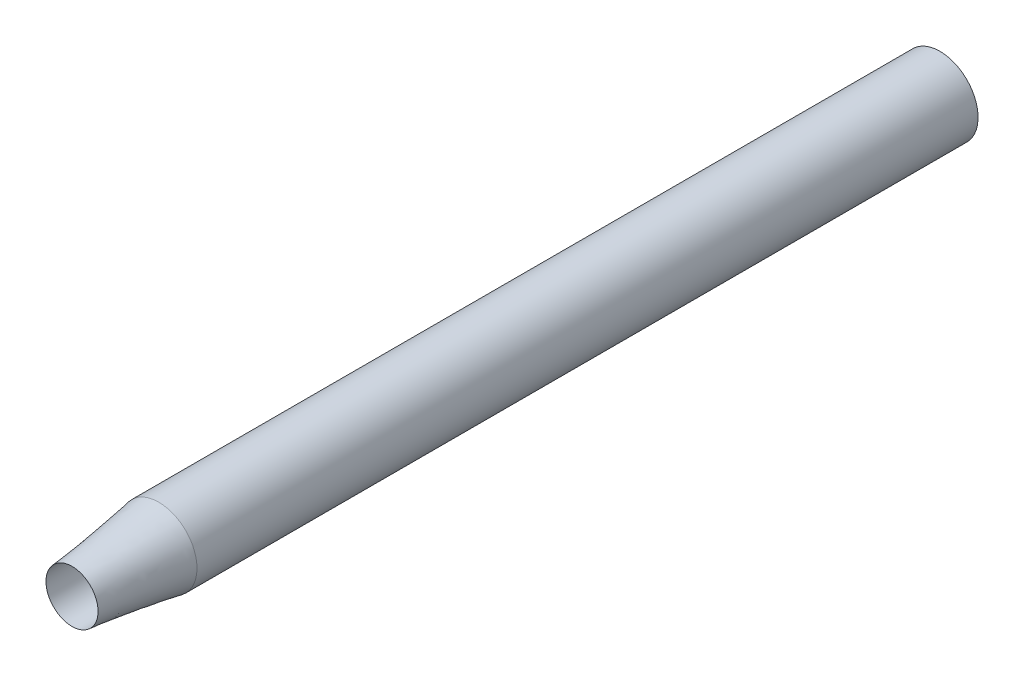
ISO-10303-21;
HEADER;
FILE_DESCRIPTION(('STEP AP214'),'2;1');
FILE_NAME('part.step','',(''),(''),'','','');
FILE_SCHEMA(('AUTOMOTIVE_DESIGN { 1 0 10303 214 1 1 1 1 }'));
ENDSEC;
DATA;
#1=APPLICATION_CONTEXT('core data for automotive mechanical design processes');
#2=APPLICATION_PROTOCOL_DEFINITION('international standard','automotive_design',2000,#1);
#3=PRODUCT_CONTEXT('',#1,'mechanical');
#4=PRODUCT('Part','Part','',(#3));
#5=PRODUCT_RELATED_PRODUCT_CATEGORY('part','',(#4));
#6=PRODUCT_DEFINITION_FORMATION('','',#4);
#7=PRODUCT_DEFINITION_CONTEXT('part definition',#1,'design');
#8=PRODUCT_DEFINITION('design','',#6,#7);
#9=PRODUCT_DEFINITION_SHAPE('','',#8);
#10=(LENGTH_UNIT() NAMED_UNIT(*) SI_UNIT(.MILLI.,.METRE.));
#11=(NAMED_UNIT(*) PLANE_ANGLE_UNIT() SI_UNIT($,.RADIAN.));
#12=(NAMED_UNIT(*) SI_UNIT($,.STERADIAN.) SOLID_ANGLE_UNIT());
#13=UNCERTAINTY_MEASURE_WITH_UNIT(LENGTH_MEASURE(1.E-05),#10,'distance_accuracy_value','');
#14=(GEOMETRIC_REPRESENTATION_CONTEXT(3) GLOBAL_UNCERTAINTY_ASSIGNED_CONTEXT((#13)) GLOBAL_UNIT_ASSIGNED_CONTEXT((#10,
#11,#12)) REPRESENTATION_CONTEXT('',''));
#15=CARTESIAN_POINT('',(0.,0.,0.));
#16=DIRECTION('',(0.,0.,1.));
#17=DIRECTION('',(1.,0.,0.));
#18=AXIS2_PLACEMENT_3D('',#15,#16,#17);
#19=CARTESIAN_POINT('',(0.,0.,45.));
#20=DIRECTION('',(0.,0.,-1.));
#21=DIRECTION('',(-1.,0.,0.));
#22=AXIS2_PLACEMENT_3D('',#19,#20,#21);
#23=CYLINDRICAL_SURFACE('',#22,2.2);
#24=CARTESIAN_POINT('',(0.,0.,45.));
#25=DIRECTION('',(0.,0.,-1.));
#26=DIRECTION('',(-1.,0.,0.));
#27=AXIS2_PLACEMENT_3D('',#24,#25,#26);
#28=CIRCLE('',#27,2.2);
#29=CARTESIAN_POINT('',(-2.2,0.,45.));
#30=VERTEX_POINT('',#29);
#31=EDGE_CURVE('E11',#30,#30,#28,.F.);
#32=CARTESIAN_POINT('',(0.,0.,0.));
#33=DIRECTION('',(0.,0.,1.));
#34=DIRECTION('',(1.,0.,0.));
#35=AXIS2_PLACEMENT_3D('',#32,#33,#34);
#36=CIRCLE('',#35,2.2);
#37=CARTESIAN_POINT('',(-2.2,0.,0.));
#38=VERTEX_POINT('',#37);
#39=EDGE_CURVE('E60',#38,#38,#36,.T.);
#40=CARTESIAN_POINT('',(-2.2,0.,45.));
#41=CARTESIAN_POINT('',(-2.2,0.,44.53125));
#42=CARTESIAN_POINT('',(-2.2,0.,44.0625));
#43=CARTESIAN_POINT('',(-2.2,0.,43.125));
#44=CARTESIAN_POINT('',(-2.2,0.,42.65625));
#45=CARTESIAN_POINT('',(-2.2,0.,41.71875));
#46=CARTESIAN_POINT('',(-2.2,0.,41.25));
#47=CARTESIAN_POINT('',(-2.2,0.,40.3125));
#48=CARTESIAN_POINT('',(-2.2,0.,39.84375));
#49=CARTESIAN_POINT('',(-2.2,0.,38.90625));
#50=CARTESIAN_POINT('',(-2.2,0.,38.4375));
#51=CARTESIAN_POINT('',(-2.2,0.,37.5));
#52=CARTESIAN_POINT('',(-2.2,0.,37.03125));
#53=CARTESIAN_POINT('',(-2.2,0.,36.09375));
#54=CARTESIAN_POINT('',(-2.2,0.,35.625));
#55=CARTESIAN_POINT('',(-2.2,0.,34.6875));
#56=CARTESIAN_POINT('',(-2.2,0.,34.21875));
#57=CARTESIAN_POINT('',(-2.2,0.,33.28125));
#58=CARTESIAN_POINT('',(-2.2,0.,32.8125));
#59=CARTESIAN_POINT('',(-2.2,0.,31.875));
#60=CARTESIAN_POINT('',(-2.2,0.,31.40625));
#61=CARTESIAN_POINT('',(-2.2,0.,30.46875));
#62=CARTESIAN_POINT('',(-2.2,0.,30.));
#63=CARTESIAN_POINT('',(-2.2,0.,29.0625));
#64=CARTESIAN_POINT('',(-2.2,0.,28.59375));
#65=CARTESIAN_POINT('',(-2.2,0.,27.65625));
#66=CARTESIAN_POINT('',(-2.2,0.,27.1875));
#67=CARTESIAN_POINT('',(-2.2,0.,26.25));
#68=CARTESIAN_POINT('',(-2.2,0.,25.78125));
#69=CARTESIAN_POINT('',(-2.2,0.,24.84375));
#70=CARTESIAN_POINT('',(-2.2,0.,24.375));
#71=CARTESIAN_POINT('',(-2.2,0.,23.4375));
#72=CARTESIAN_POINT('',(-2.2,0.,22.96875));
#73=CARTESIAN_POINT('',(-2.2,0.,22.03125));
#74=CARTESIAN_POINT('',(-2.2,0.,21.5625));
#75=CARTESIAN_POINT('',(-2.2,0.,20.625));
#76=CARTESIAN_POINT('',(-2.2,0.,20.15625));
#77=CARTESIAN_POINT('',(-2.2,0.,19.21875));
#78=CARTESIAN_POINT('',(-2.2,0.,18.75));
#79=CARTESIAN_POINT('',(-2.2,0.,17.8125));
#80=CARTESIAN_POINT('',(-2.2,0.,17.34375));
#81=CARTESIAN_POINT('',(-2.2,0.,16.40625));
#82=CARTESIAN_POINT('',(-2.2,0.,15.9375));
#83=CARTESIAN_POINT('',(-2.2,0.,15.));
#84=CARTESIAN_POINT('',(-2.2,0.,14.53125));
#85=CARTESIAN_POINT('',(-2.2,0.,13.59375));
#86=CARTESIAN_POINT('',(-2.2,0.,13.125));
#87=CARTESIAN_POINT('',(-2.2,0.,12.1875));
#88=CARTESIAN_POINT('',(-2.2,0.,11.71875));
#89=CARTESIAN_POINT('',(-2.2,0.,10.78125));
#90=CARTESIAN_POINT('',(-2.2,0.,10.3125));
#91=CARTESIAN_POINT('',(-2.2,0.,9.375));
#92=CARTESIAN_POINT('',(-2.2,0.,8.90625));
#93=CARTESIAN_POINT('',(-2.2,0.,7.96874999999999));
#94=CARTESIAN_POINT('',(-2.2,0.,7.5));
#95=CARTESIAN_POINT('',(-2.2,0.,6.5625));
#96=CARTESIAN_POINT('',(-2.2,0.,6.09375));
#97=CARTESIAN_POINT('',(-2.2,0.,5.15625));
#98=CARTESIAN_POINT('',(-2.2,0.,4.68749999999999));
#99=CARTESIAN_POINT('',(-2.2,0.,3.74999999999999));
#100=CARTESIAN_POINT('',(-2.2,0.,3.28124999999999));
#101=CARTESIAN_POINT('',(-2.2,0.,2.34374999999999));
#102=CARTESIAN_POINT('',(-2.2,0.,1.87499999999999));
#103=CARTESIAN_POINT('',(-2.2,0.,0.937499999999992));
#104=CARTESIAN_POINT('',(-2.2,0.,0.468749999999993));
#105=CARTESIAN_POINT('',(-2.2,0.,0.));
#106=B_SPLINE_CURVE_WITH_KNOTS('',3,(#40,#41,#42,#43,#44,#45,#46,#47,#48,#49,#50,#51,#52,#53,
#54,#55,#56,#57,#58,#59,#60,#61,#62,#63,#64,#65,#66,#67,#68,#69,#70,#71,#72,#73,#74,#75,#76,#77,
#78,#79,#80,#81,#82,#83,#84,#85,#86,#87,#88,#89,#90,#91,#92,#93,#94,#95,#96,#97,#98,#99,#100,
#101,#102,#103,#104,#105),.UNSPECIFIED.,.F.,.F.,(4,2,2,2,2,2,2,2,2,2,2,2,2,2,2,2,2,2,2,2,2,2,2,
2,2,2,2,2,2,2,2,2,4),(0.,1.40625,2.8125,4.21874999999999,5.625,7.03125,8.4375,9.84375,11.25,
12.65625,14.0625,15.46875,16.875,18.28125,19.6875,21.09375,22.5,23.90625,25.3125,26.71875,
28.125,29.53125,30.9375,32.34375,33.75,35.15625,36.5625,37.96875,39.375,40.78125,42.1875,
43.59375,45.),.UNSPECIFIED.);
#107=EDGE_CURVE('BSEAM50',#30,#38,#106,.T.);
#108=ORIENTED_EDGE('',*,*,#31,.F.);
#109=ORIENTED_EDGE('',*,*,#39,.T.);
#110=ORIENTED_EDGE('',*,*,#107,.T.);
#111=ORIENTED_EDGE('',*,*,#107,.F.);
#112=EDGE_LOOP('',(#108,#110,#109,#111));
#113=FACE_BOUND('',#112,.T.);
#114=ADVANCED_FACE('F50',(#113),#23,.T.);
#115=CARTESIAN_POINT('',(0.,0.,0.));
#116=DIRECTION('',(0.,0.,1.));
#117=DIRECTION('',(1.,0.,0.));
#118=AXIS2_PLACEMENT_3D('',#115,#116,#117);
#119=PLANE('',#118);
#120=CARTESIAN_POINT('',(0.,0.,0.));
#121=DIRECTION('',(0.,0.,1.));
#122=DIRECTION('',(1.,0.,0.));
#123=AXIS2_PLACEMENT_3D('',#120,#121,#122);
#124=CIRCLE('',#123,1.5);
#125=CARTESIAN_POINT('',(1.5,0.,0.));
#126=VERTEX_POINT('',#125);
#127=EDGE_CURVE('E65',#126,#126,#124,.T.);
#128=ORIENTED_EDGE('',*,*,#127,.T.);
#129=EDGE_LOOP('',(#128));
#130=FACE_BOUND('',#129,.T.);
#131=ORIENTED_EDGE('',*,*,#39,.F.);
#132=EDGE_LOOP('',(#131));
#133=FACE_BOUND('',#132,.T.);
#134=ADVANCED_FACE('F94',(#130,#133),#119,.F.);
#135=CARTESIAN_POINT('',(-2.01519781530866,0.882597170387032,45.));
#136=CARTESIAN_POINT('',(-1.49874920151381,-0.061244027967765,50.));
#137=CARTESIAN_POINT('',(-3.78039215608273,-3.14779846023029,45.));
#138=CARTESIAN_POINT('',(-1.37626114557828,-3.05874243099538,50.));
#139=CARTESIAN_POINT('',(0.250003474534598,-4.91299280100436,45.));
#140=CARTESIAN_POINT('',(1.62123725744934,-2.93625437505985,50.));
#141=CARTESIAN_POINT('',(2.01519781530866,-0.882597170387032,45.));
#142=CARTESIAN_POINT('',(1.49874920151381,0.0612440279677639,50.));
#143=CARTESIAN_POINT('',(3.78039215608273,3.14779846023029,45.));
#144=CARTESIAN_POINT('',(1.37626114557828,3.05874243099538,50.));
#145=CARTESIAN_POINT('',(-0.2500034745346,4.91299280100436,45.));
#146=CARTESIAN_POINT('',(-1.62123725744934,2.93625437505986,50.));
#147=CARTESIAN_POINT('',(-2.01519781530866,0.882597170387032,45.));
#148=CARTESIAN_POINT('',(-1.49874920151381,-0.061244027967765,50.));
#149=(BOUNDED_SURFACE() B_SPLINE_SURFACE(3,1,((#135,#136),(#137,#138),(#139,#140),(#141,#142),
(#143,#144),(#145,#146),(#147,#148)),.UNSPECIFIED.,.T.,.F.,.F.) B_SPLINE_SURFACE_WITH_KNOTS((4,
3,4),(2,2),(0.,0.5,1.),(0.,1.),
.UNSPECIFIED.) GEOMETRIC_REPRESENTATION_ITEM() RATIONAL_B_SPLINE_SURFACE(((1.,1.),
(0.333333333333333,0.333333333333334),(0.333333333333333,0.333333333333334),(1.,1.),
(0.333333333333333,0.333333333333333),(0.333333333333333,0.333333333333333),(1.,1.))) REPRESENTATION_ITEM('') SURFACE());
#150=CARTESIAN_POINT('',(-1.49874920151381,-0.0612440279677604,50.));
#151=CARTESIAN_POINT('',(-1.62123725744933,2.93625437505987,50.));
#152=CARTESIAN_POINT('',(1.37626114557829,3.05874243099538,50.));
#153=CARTESIAN_POINT('',(1.49874920151381,0.0612440279677593,50.));
#154=CARTESIAN_POINT('',(1.62123725744933,-2.93625437505986,50.));
#155=CARTESIAN_POINT('',(-1.37626114557829,-3.05874243099538,50.));
#156=CARTESIAN_POINT('',(-1.49874920151381,-0.0612440279677604,50.));
#157=(BOUNDED_CURVE() B_SPLINE_CURVE(3,(#150,#151,#152,#153,#154,#155,#156),.UNSPECIFIED.,.T.,
.F.) B_SPLINE_CURVE_WITH_KNOTS((4,3,4),(0.,0.5,1.),
.UNSPECIFIED.) CURVE() GEOMETRIC_REPRESENTATION_ITEM() RATIONAL_B_SPLINE_CURVE((1.,
0.333333333333333,0.333333333333333,1.,0.333333333333334,0.333333333333334,1.)) REPRESENTATION_ITEM(''));
#158=CARTESIAN_POINT('',(-1.49874920151381,-0.0612440279677604,50.));
#159=VERTEX_POINT('',#158);
#160=EDGE_CURVE('E72',#159,#159,#157,.F.);
#161=ORIENTED_EDGE('',*,*,#31,.T.);
#162=EDGE_LOOP('',(#161));
#163=FACE_BOUND('',#162,.T.);
#164=ORIENTED_EDGE('',*,*,#160,.F.);
#165=EDGE_LOOP('',(#164));
#166=FACE_BOUND('',#165,.T.);
#167=ADVANCED_FACE('F82',(#163,#166),#149,.T.);
#168=CARTESIAN_POINT('',(0.,0.,0.));
#169=DIRECTION('',(0.,0.,1.));
#170=DIRECTION('',(1.,0.,0.));
#171=AXIS2_PLACEMENT_3D('',#168,#169,#170);
#172=CYLINDRICAL_SURFACE('',#171,1.5);
#173=ORIENTED_EDGE('',*,*,#127,.F.);
#174=EDGE_LOOP('',(#173));
#175=FACE_BOUND('',#174,.T.);
#176=ORIENTED_EDGE('',*,*,#160,.T.);
#177=EDGE_LOOP('',(#176));
#178=FACE_BOUND('',#177,.T.);
#179=ADVANCED_FACE('F75',(#175,#178),#172,.F.);
#180=CLOSED_SHELL('',(#114,#134,#167,#179));
#181=MANIFOLD_SOLID_BREP('B2',#180);
#182=ADVANCED_BREP_SHAPE_REPRESENTATION('',(#18,#181),#14);
#183=SHAPE_DEFINITION_REPRESENTATION(#9,#182);
ENDSEC;
END-ISO-10303-21;
